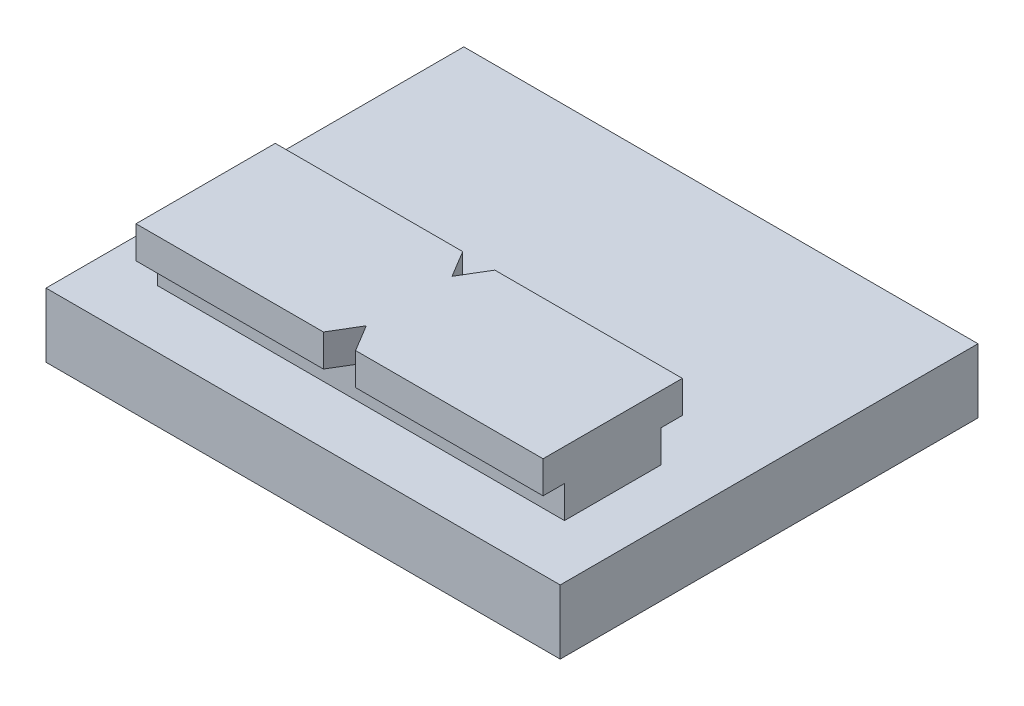
ISO-10303-21;
HEADER;
FILE_DESCRIPTION(('STEP AP214'),'2;1');
FILE_NAME('part.step','',(''),(''),'','','');
FILE_SCHEMA(('AUTOMOTIVE_DESIGN { 1 0 10303 214 1 1 1 1 }'));
ENDSEC;
DATA;
#1=APPLICATION_CONTEXT('core data for automotive mechanical design processes');
#2=APPLICATION_PROTOCOL_DEFINITION('international standard','automotive_design',2000,#1);
#3=PRODUCT_CONTEXT('',#1,'mechanical');
#4=PRODUCT('Part','Part','',(#3));
#5=PRODUCT_RELATED_PRODUCT_CATEGORY('part','',(#4));
#6=PRODUCT_DEFINITION_FORMATION('','',#4);
#7=PRODUCT_DEFINITION_CONTEXT('part definition',#1,'design');
#8=PRODUCT_DEFINITION('design','',#6,#7);
#9=PRODUCT_DEFINITION_SHAPE('','',#8);
#10=(LENGTH_UNIT() NAMED_UNIT(*) SI_UNIT(.MILLI.,.METRE.));
#11=(NAMED_UNIT(*) PLANE_ANGLE_UNIT() SI_UNIT($,.RADIAN.));
#12=(NAMED_UNIT(*) SI_UNIT($,.STERADIAN.) SOLID_ANGLE_UNIT());
#13=UNCERTAINTY_MEASURE_WITH_UNIT(LENGTH_MEASURE(1.E-05),#10,'distance_accuracy_value','');
#14=(GEOMETRIC_REPRESENTATION_CONTEXT(3) GLOBAL_UNCERTAINTY_ASSIGNED_CONTEXT((#13)) GLOBAL_UNIT_ASSIGNED_CONTEXT((#10,
#11,#12)) REPRESENTATION_CONTEXT('',''));
#15=CARTESIAN_POINT('',(0.,0.,0.));
#16=DIRECTION('',(0.,0.,1.));
#17=DIRECTION('',(1.,0.,0.));
#18=AXIS2_PLACEMENT_3D('',#15,#16,#17);
#19=CARTESIAN_POINT('',(-9.5,6.,8.05));
#20=DIRECTION('',(0.,0.,-1.));
#21=DIRECTION('',(-1.,0.,0.));
#22=AXIS2_PLACEMENT_3D('',#19,#20,#21);
#23=PLANE('',#22);
#24=DIRECTION('',(1.,0.,0.));
#25=VECTOR('',#24,1.);
#26=CARTESIAN_POINT('',(-9.5,6.,8.05));
#27=LINE('',#26,#25);
#28=CARTESIAN_POINT('',(0.750000000000001,6.,8.05));
#29=VERTEX_POINT('',#28);
#30=CARTESIAN_POINT('',(9.5,6.,8.05));
#31=VERTEX_POINT('',#30);
#32=EDGE_CURVE('E190',#29,#31,#27,.T.);
#33=ORIENTED_EDGE('',*,*,#32,.F.);
#34=DIRECTION('',(0.,1.,0.));
#35=VECTOR('',#34,1.);
#36=CARTESIAN_POINT('',(0.750000000000001,2.54743758102334,8.05));
#37=LINE('',#36,#35);
#38=CARTESIAN_POINT('',(0.750000000000001,4.5,8.05));
#39=VERTEX_POINT('',#38);
#40=EDGE_CURVE('E176',#39,#29,#37,.T.);
#41=ORIENTED_EDGE('',*,*,#40,.F.);
#42=DIRECTION('',(1.,0.,0.));
#43=VECTOR('',#42,1.);
#44=CARTESIAN_POINT('',(-9.5,4.5,8.05));
#45=LINE('',#44,#43);
#46=CARTESIAN_POINT('',(9.5,4.5,8.05));
#47=VERTEX_POINT('',#46);
#48=EDGE_CURVE('E188',#39,#47,#45,.T.);
#49=ORIENTED_EDGE('',*,*,#48,.T.);
#50=DIRECTION('',(0.,-1.,0.));
#51=VECTOR('',#50,1.);
#52=CARTESIAN_POINT('',(9.5,6.,8.05));
#53=LINE('',#52,#51);
#54=EDGE_CURVE('E209',#31,#47,#53,.T.);
#55=ORIENTED_EDGE('',*,*,#54,.F.);
#56=EDGE_LOOP('',(#33,#41,#49,#55));
#57=FACE_BOUND('',#56,.T.);
#58=ADVANCED_FACE('F35',(#57),#23,.F.);
#59=CARTESIAN_POINT('',(0.,4.5,0.));
#60=DIRECTION('',(0.,-1.,0.));
#61=DIRECTION('',(0.,0.,-1.));
#62=AXIS2_PLACEMENT_3D('',#59,#60,#61);
#63=PLANE('',#62);
#64=DIRECTION('',(-0.514495755427527,0.,-0.857492925712544));
#65=VECTOR('',#64,1.);
#66=CARTESIAN_POINT('',(0.,4.5,6.8));
#67=LINE('',#66,#65);
#68=CARTESIAN_POINT('',(0.150000000000001,4.5,7.05));
#69=VERTEX_POINT('',#68);
#70=EDGE_CURVE('E172',#39,#69,#67,.T.);
#71=ORIENTED_EDGE('',*,*,#70,.T.);
#72=DIRECTION('',(1.,0.,0.));
#73=VECTOR('',#72,1.);
#74=CARTESIAN_POINT('',(-9.5,4.5,7.05));
#75=LINE('',#74,#73);
#76=CARTESIAN_POINT('',(9.5,4.5,7.05));
#77=VERTEX_POINT('',#76);
#78=EDGE_CURVE('E294',#69,#77,#75,.T.);
#79=ORIENTED_EDGE('',*,*,#78,.T.);
#80=DIRECTION('',(0.,0.,-1.));
#81=VECTOR('',#80,1.);
#82=CARTESIAN_POINT('',(9.5,4.5,8.05));
#83=LINE('',#82,#81);
#84=EDGE_CURVE('E196',#47,#77,#83,.T.);
#85=ORIENTED_EDGE('',*,*,#84,.F.);
#86=ORIENTED_EDGE('',*,*,#48,.F.);
#87=EDGE_LOOP('',(#71,#79,#85,#86));
#88=FACE_BOUND('',#87,.T.);
#89=ADVANCED_FACE('F194',(#88),#63,.T.);
#90=DIRECTION('',(0.514495755427527,0.,-0.857492925712544));
#91=VECTOR('',#90,1.);
#92=CARTESIAN_POINT('',(0.,4.5,2.8));
#93=LINE('',#92,#91);
#94=CARTESIAN_POINT('',(0.149999999999998,4.5,2.55));
#95=VERTEX_POINT('',#94);
#96=CARTESIAN_POINT('',(0.75,4.5,1.55));
#97=VERTEX_POINT('',#96);
#98=EDGE_CURVE('E301',#95,#97,#93,.T.);
#99=ORIENTED_EDGE('',*,*,#98,.T.);
#100=DIRECTION('',(-1.,0.,0.));
#101=VECTOR('',#100,1.);
#102=CARTESIAN_POINT('',(-9.5,4.5,1.55));
#103=LINE('',#102,#101);
#104=CARTESIAN_POINT('',(9.5,4.5,1.55));
#105=VERTEX_POINT('',#104);
#106=EDGE_CURVE('E229',#105,#97,#103,.T.);
#107=ORIENTED_EDGE('',*,*,#106,.F.);
#108=CARTESIAN_POINT('',(9.5,4.5,2.55));
#109=VERTEX_POINT('',#108);
#110=EDGE_CURVE('E225',#109,#105,#83,.T.);
#111=ORIENTED_EDGE('',*,*,#110,.F.);
#112=DIRECTION('',(-1.,0.,0.));
#113=VECTOR('',#112,1.);
#114=CARTESIAN_POINT('',(-9.5,4.5,2.55));
#115=LINE('',#114,#113);
#116=EDGE_CURVE('E258',#109,#95,#115,.T.);
#117=ORIENTED_EDGE('',*,*,#116,.T.);
#118=EDGE_LOOP('',(#99,#107,#111,#117));
#119=FACE_BOUND('',#118,.T.);
#120=ADVANCED_FACE('F300',(#119),#63,.T.);
#121=CARTESIAN_POINT('',(-9.5,6.,1.55));
#122=DIRECTION('',(0.,0.,1.));
#123=DIRECTION('',(1.,0.,0.));
#124=AXIS2_PLACEMENT_3D('',#121,#122,#123);
#125=PLANE('',#124);
#126=ORIENTED_EDGE('',*,*,#106,.T.);
#127=DIRECTION('',(0.,1.,0.));
#128=VECTOR('',#127,1.);
#129=CARTESIAN_POINT('',(0.75,2.54743758102334,1.55));
#130=LINE('',#129,#128);
#131=CARTESIAN_POINT('',(0.75,6.,1.55));
#132=VERTEX_POINT('',#131);
#133=EDGE_CURVE('E372',#97,#132,#130,.T.);
#134=ORIENTED_EDGE('',*,*,#133,.T.);
#135=DIRECTION('',(-1.,0.,0.));
#136=VECTOR('',#135,1.);
#137=CARTESIAN_POINT('',(-9.5,6.,1.55));
#138=LINE('',#137,#136);
#139=CARTESIAN_POINT('',(9.5,6.,1.55));
#140=VERTEX_POINT('',#139);
#141=EDGE_CURVE('E383',#140,#132,#138,.T.);
#142=ORIENTED_EDGE('',*,*,#141,.F.);
#143=DIRECTION('',(0.,-1.,0.));
#144=VECTOR('',#143,1.);
#145=CARTESIAN_POINT('',(9.5,6.,1.55));
#146=LINE('',#145,#144);
#147=EDGE_CURVE('E218',#140,#105,#146,.T.);
#148=ORIENTED_EDGE('',*,*,#147,.T.);
#149=EDGE_LOOP('',(#126,#134,#142,#148));
#150=FACE_BOUND('',#149,.T.);
#151=ADVANCED_FACE('F395',(#150),#125,.F.);
#152=CARTESIAN_POINT('',(0.,3.,0.));
#153=DIRECTION('',(0.,-1.,0.));
#154=DIRECTION('',(0.,0.,-1.));
#155=AXIS2_PLACEMENT_3D('',#152,#153,#154);
#156=PLANE('',#155);
#157=DIRECTION('',(0.,0.,-1.));
#158=VECTOR('',#157,1.);
#159=CARTESIAN_POINT('',(12.,3.,9.75));
#160=LINE('',#159,#158);
#161=CARTESIAN_POINT('',(12.,3.,9.75));
#162=VERTEX_POINT('',#161);
#163=CARTESIAN_POINT('',(12.,3.,-9.75));
#164=VERTEX_POINT('',#163);
#165=EDGE_CURVE('E315',#162,#164,#160,.T.);
#166=ORIENTED_EDGE('',*,*,#165,.T.);
#167=DIRECTION('',(-1.,0.,0.));
#168=VECTOR('',#167,1.);
#169=CARTESIAN_POINT('',(-12.,3.,-9.75));
#170=LINE('',#169,#168);
#171=CARTESIAN_POINT('',(-12.,3.,-9.75));
#172=VERTEX_POINT('',#171);
#173=EDGE_CURVE('E318',#164,#172,#170,.T.);
#174=ORIENTED_EDGE('',*,*,#173,.T.);
#175=DIRECTION('',(0.,0.,1.));
#176=VECTOR('',#175,1.);
#177=CARTESIAN_POINT('',(-12.,3.,9.75));
#178=LINE('',#177,#176);
#179=CARTESIAN_POINT('',(-12.,3.,9.75));
#180=VERTEX_POINT('',#179);
#181=EDGE_CURVE('E321',#172,#180,#178,.T.);
#182=ORIENTED_EDGE('',*,*,#181,.T.);
#183=DIRECTION('',(1.,0.,0.));
#184=VECTOR('',#183,1.);
#185=CARTESIAN_POINT('',(-12.,3.,9.75));
#186=LINE('',#185,#184);
#187=EDGE_CURVE('E323',#180,#162,#186,.T.);
#188=ORIENTED_EDGE('',*,*,#187,.T.);
#189=EDGE_LOOP('',(#166,#174,#182,#188));
#190=FACE_BOUND('',#189,.T.);
#191=DIRECTION('',(0.,0.,-1.));
#192=VECTOR('',#191,1.);
#193=CARTESIAN_POINT('',(9.5,3.,7.05));
#194=LINE('',#193,#192);
#195=CARTESIAN_POINT('',(9.5,3.,7.05));
#196=VERTEX_POINT('',#195);
#197=CARTESIAN_POINT('',(9.5,3.,2.55));
#198=VERTEX_POINT('',#197);
#199=EDGE_CURVE('E221',#196,#198,#194,.T.);
#200=ORIENTED_EDGE('',*,*,#199,.F.);
#201=DIRECTION('',(1.,0.,0.));
#202=VECTOR('',#201,1.);
#203=CARTESIAN_POINT('',(-9.5,3.,7.05));
#204=LINE('',#203,#202);
#205=CARTESIAN_POINT('',(-9.5,3.,7.05));
#206=VERTEX_POINT('',#205);
#207=EDGE_CURVE('E259',#206,#196,#204,.T.);
#208=ORIENTED_EDGE('',*,*,#207,.F.);
#209=DIRECTION('',(0.,0.,1.));
#210=VECTOR('',#209,1.);
#211=CARTESIAN_POINT('',(-9.5,3.,7.05));
#212=LINE('',#211,#210);
#213=CARTESIAN_POINT('',(-9.5,3.,2.55));
#214=VERTEX_POINT('',#213);
#215=EDGE_CURVE('E311',#214,#206,#212,.T.);
#216=ORIENTED_EDGE('',*,*,#215,.F.);
#217=DIRECTION('',(-1.,0.,0.));
#218=VECTOR('',#217,1.);
#219=CARTESIAN_POINT('',(-9.5,3.,2.55));
#220=LINE('',#219,#218);
#221=EDGE_CURVE('E265',#198,#214,#220,.T.);
#222=ORIENTED_EDGE('',*,*,#221,.F.);
#223=EDGE_LOOP('',(#200,#208,#216,#222));
#224=FACE_BOUND('',#223,.T.);
#225=ADVANCED_FACE('F392',(#190,#224),#156,.F.);
#226=CARTESIAN_POINT('',(12.,3.,9.75));
#227=DIRECTION('',(-1.,0.,0.));
#228=DIRECTION('',(0.,0.,1.));
#229=AXIS2_PLACEMENT_3D('',#226,#227,#228);
#230=PLANE('',#229);
#231=DIRECTION('',(0.,0.,-1.));
#232=VECTOR('',#231,1.);
#233=CARTESIAN_POINT('',(12.,0.,9.75));
#234=LINE('',#233,#232);
#235=CARTESIAN_POINT('',(12.,0.,9.75));
#236=VERTEX_POINT('',#235);
#237=CARTESIAN_POINT('',(12.,0.,-9.75));
#238=VERTEX_POINT('',#237);
#239=EDGE_CURVE('E269',#236,#238,#234,.T.);
#240=ORIENTED_EDGE('',*,*,#239,.T.);
#241=DIRECTION('',(0.,-1.,0.));
#242=VECTOR('',#241,1.);
#243=CARTESIAN_POINT('',(12.,3.,-9.75));
#244=LINE('',#243,#242);
#245=EDGE_CURVE('E43',#164,#238,#244,.T.);
#246=ORIENTED_EDGE('',*,*,#245,.F.);
#247=ORIENTED_EDGE('',*,*,#165,.F.);
#248=DIRECTION('',(0.,-1.,0.));
#249=VECTOR('',#248,1.);
#250=CARTESIAN_POINT('',(12.,3.,9.75));
#251=LINE('',#250,#249);
#252=EDGE_CURVE('E325',#162,#236,#251,.T.);
#253=ORIENTED_EDGE('',*,*,#252,.T.);
#254=EDGE_LOOP('',(#240,#246,#247,#253));
#255=FACE_BOUND('',#254,.T.);
#256=ADVANCED_FACE('F37',(#255),#230,.F.);
#257=CARTESIAN_POINT('',(-12.,3.,-9.75));
#258=DIRECTION('',(0.,0.,1.));
#259=DIRECTION('',(1.,0.,0.));
#260=AXIS2_PLACEMENT_3D('',#257,#258,#259);
#261=PLANE('',#260);
#262=DIRECTION('',(-1.,0.,0.));
#263=VECTOR('',#262,1.);
#264=CARTESIAN_POINT('',(-12.,0.,-9.75));
#265=LINE('',#264,#263);
#266=CARTESIAN_POINT('',(-12.,0.,-9.75));
#267=VERTEX_POINT('',#266);
#268=EDGE_CURVE('E328',#238,#267,#265,.T.);
#269=ORIENTED_EDGE('',*,*,#268,.T.);
#270=DIRECTION('',(0.,-1.,0.));
#271=VECTOR('',#270,1.);
#272=CARTESIAN_POINT('',(-12.,3.,-9.75));
#273=LINE('',#272,#271);
#274=EDGE_CURVE('E338',#172,#267,#273,.T.);
#275=ORIENTED_EDGE('',*,*,#274,.F.);
#276=ORIENTED_EDGE('',*,*,#173,.F.);
#277=ORIENTED_EDGE('',*,*,#245,.T.);
#278=EDGE_LOOP('',(#269,#275,#276,#277));
#279=FACE_BOUND('',#278,.T.);
#280=ADVANCED_FACE('F581',(#279),#261,.F.);
#281=CARTESIAN_POINT('',(-12.,3.,9.75));
#282=DIRECTION('',(1.,0.,0.));
#283=DIRECTION('',(0.,0.,-1.));
#284=AXIS2_PLACEMENT_3D('',#281,#282,#283);
#285=PLANE('',#284);
#286=DIRECTION('',(0.,0.,1.));
#287=VECTOR('',#286,1.);
#288=CARTESIAN_POINT('',(-12.,0.,9.75));
#289=LINE('',#288,#287);
#290=CARTESIAN_POINT('',(-12.,0.,9.75));
#291=VERTEX_POINT('',#290);
#292=EDGE_CURVE('E330',#267,#291,#289,.T.);
#293=ORIENTED_EDGE('',*,*,#292,.T.);
#294=DIRECTION('',(0.,-1.,0.));
#295=VECTOR('',#294,1.);
#296=CARTESIAN_POINT('',(-12.,3.,9.75));
#297=LINE('',#296,#295);
#298=EDGE_CURVE('E335',#180,#291,#297,.T.);
#299=ORIENTED_EDGE('',*,*,#298,.F.);
#300=ORIENTED_EDGE('',*,*,#181,.F.);
#301=ORIENTED_EDGE('',*,*,#274,.T.);
#302=EDGE_LOOP('',(#293,#299,#300,#301));
#303=FACE_BOUND('',#302,.T.);
#304=ADVANCED_FACE('F573',(#303),#285,.F.);
#305=CARTESIAN_POINT('',(-12.,3.,9.75));
#306=DIRECTION('',(0.,0.,-1.));
#307=DIRECTION('',(-1.,0.,0.));
#308=AXIS2_PLACEMENT_3D('',#305,#306,#307);
#309=PLANE('',#308);
#310=DIRECTION('',(1.,0.,0.));
#311=VECTOR('',#310,1.);
#312=CARTESIAN_POINT('',(-12.,0.,9.75));
#313=LINE('',#312,#311);
#314=EDGE_CURVE('E319',#291,#236,#313,.T.);
#315=ORIENTED_EDGE('',*,*,#314,.T.);
#316=ORIENTED_EDGE('',*,*,#252,.F.);
#317=ORIENTED_EDGE('',*,*,#187,.F.);
#318=ORIENTED_EDGE('',*,*,#298,.T.);
#319=EDGE_LOOP('',(#315,#316,#317,#318));
#320=FACE_BOUND('',#319,.T.);
#321=ADVANCED_FACE('F565',(#320),#309,.F.);
#322=CARTESIAN_POINT('',(0.,0.,0.));
#323=DIRECTION('',(0.,-1.,0.));
#324=DIRECTION('',(0.,0.,-1.));
#325=AXIS2_PLACEMENT_3D('',#322,#323,#324);
#326=PLANE('',#325);
#327=ORIENTED_EDGE('',*,*,#239,.F.);
#328=ORIENTED_EDGE('',*,*,#314,.F.);
#329=ORIENTED_EDGE('',*,*,#292,.F.);
#330=ORIENTED_EDGE('',*,*,#268,.F.);
#331=EDGE_LOOP('',(#327,#328,#329,#330));
#332=FACE_BOUND('',#331,.T.);
#333=ADVANCED_FACE('F541',(#332),#326,.T.);
#334=CARTESIAN_POINT('',(9.5,4.5,7.05));
#335=DIRECTION('',(-1.,0.,0.));
#336=DIRECTION('',(0.,0.,1.));
#337=AXIS2_PLACEMENT_3D('',#334,#335,#336);
#338=PLANE('',#337);
#339=ORIENTED_EDGE('',*,*,#199,.T.);
#340=DIRECTION('',(0.,-1.,0.));
#341=VECTOR('',#340,1.);
#342=CARTESIAN_POINT('',(9.5,4.5,2.55));
#343=LINE('',#342,#341);
#344=EDGE_CURVE('E266',#109,#198,#343,.T.);
#345=ORIENTED_EDGE('',*,*,#344,.F.);
#346=ORIENTED_EDGE('',*,*,#110,.T.);
#347=ORIENTED_EDGE('',*,*,#147,.F.);
#348=DIRECTION('',(0.,0.,-1.));
#349=VECTOR('',#348,1.);
#350=CARTESIAN_POINT('',(9.5,6.,8.05));
#351=LINE('',#350,#349);
#352=EDGE_CURVE('E201',#31,#140,#351,.T.);
#353=ORIENTED_EDGE('',*,*,#352,.F.);
#354=ORIENTED_EDGE('',*,*,#54,.T.);
#355=ORIENTED_EDGE('',*,*,#84,.T.);
#356=DIRECTION('',(0.,-1.,0.));
#357=VECTOR('',#356,1.);
#358=CARTESIAN_POINT('',(9.5,4.5,7.05));
#359=LINE('',#358,#357);
#360=EDGE_CURVE('E272',#77,#196,#359,.T.);
#361=ORIENTED_EDGE('',*,*,#360,.T.);
#362=EDGE_LOOP('',(#339,#345,#346,#347,#353,#354,#355,#361));
#363=FACE_BOUND('',#362,.T.);
#364=ADVANCED_FACE('F306',(#363),#338,.F.);
#365=CARTESIAN_POINT('',(-9.5,4.5,2.55));
#366=DIRECTION('',(0.,0.,1.));
#367=DIRECTION('',(1.,0.,0.));
#368=AXIS2_PLACEMENT_3D('',#365,#366,#367);
#369=PLANE('',#368);
#370=ORIENTED_EDGE('',*,*,#221,.T.);
#371=DIRECTION('',(0.,-1.,0.));
#372=VECTOR('',#371,1.);
#373=CARTESIAN_POINT('',(-9.5,4.5,2.55));
#374=LINE('',#373,#372);
#375=CARTESIAN_POINT('',(-9.5,4.5,2.55));
#376=VERTEX_POINT('',#375);
#377=EDGE_CURVE('E262',#376,#214,#374,.T.);
#378=ORIENTED_EDGE('',*,*,#377,.F.);
#379=CARTESIAN_POINT('',(-0.15,4.5,2.55));
#380=VERTEX_POINT('',#379);
#381=EDGE_CURVE('E253',#380,#376,#115,.T.);
#382=ORIENTED_EDGE('',*,*,#381,.F.);
#383=DIRECTION('',(1.,0.,0.));
#384=VECTOR('',#383,1.);
#385=CARTESIAN_POINT('',(-9.5,4.5,2.55));
#386=LINE('',#385,#384);
#387=EDGE_CURVE('E304',#380,#95,#386,.T.);
#388=ORIENTED_EDGE('',*,*,#387,.T.);
#389=ORIENTED_EDGE('',*,*,#116,.F.);
#390=ORIENTED_EDGE('',*,*,#344,.T.);
#391=EDGE_LOOP('',(#370,#378,#382,#388,#389,#390));
#392=FACE_BOUND('',#391,.T.);
#393=ADVANCED_FACE('F263',(#392),#369,.F.);
#394=CARTESIAN_POINT('',(-9.5,4.5,7.05));
#395=DIRECTION('',(1.,0.,0.));
#396=DIRECTION('',(0.,0.,-1.));
#397=AXIS2_PLACEMENT_3D('',#394,#395,#396);
#398=PLANE('',#397);
#399=ORIENTED_EDGE('',*,*,#215,.T.);
#400=DIRECTION('',(0.,-1.,0.));
#401=VECTOR('',#400,1.);
#402=CARTESIAN_POINT('',(-9.5,4.5,7.05));
#403=LINE('',#402,#401);
#404=CARTESIAN_POINT('',(-9.5,4.5,7.05));
#405=VERTEX_POINT('',#404);
#406=EDGE_CURVE('E267',#405,#206,#403,.T.);
#407=ORIENTED_EDGE('',*,*,#406,.F.);
#408=DIRECTION('',(0.,0.,1.));
#409=VECTOR('',#408,1.);
#410=CARTESIAN_POINT('',(-9.5,4.5,8.05));
#411=LINE('',#410,#409);
#412=CARTESIAN_POINT('',(-9.5,4.5,8.05));
#413=VERTEX_POINT('',#412);
#414=EDGE_CURVE('E203',#405,#413,#411,.T.);
#415=ORIENTED_EDGE('',*,*,#414,.T.);
#416=DIRECTION('',(0.,-1.,0.));
#417=VECTOR('',#416,1.);
#418=CARTESIAN_POINT('',(-9.5,6.,8.05));
#419=LINE('',#418,#417);
#420=CARTESIAN_POINT('',(-9.5,6.,8.05));
#421=VERTEX_POINT('',#420);
#422=EDGE_CURVE('E211',#421,#413,#419,.T.);
#423=ORIENTED_EDGE('',*,*,#422,.F.);
#424=DIRECTION('',(0.,0.,1.));
#425=VECTOR('',#424,1.);
#426=CARTESIAN_POINT('',(-9.5,6.,8.05));
#427=LINE('',#426,#425);
#428=CARTESIAN_POINT('',(-9.5,6.,1.55));
#429=VERTEX_POINT('',#428);
#430=EDGE_CURVE('E250',#429,#421,#427,.T.);
#431=ORIENTED_EDGE('',*,*,#430,.F.);
#432=DIRECTION('',(0.,-1.,0.));
#433=VECTOR('',#432,1.);
#434=CARTESIAN_POINT('',(-9.5,6.,1.55));
#435=LINE('',#434,#433);
#436=CARTESIAN_POINT('',(-9.5,4.5,1.55));
#437=VERTEX_POINT('',#436);
#438=EDGE_CURVE('E215',#429,#437,#435,.T.);
#439=ORIENTED_EDGE('',*,*,#438,.T.);
#440=EDGE_CURVE('E198',#437,#376,#411,.T.);
#441=ORIENTED_EDGE('',*,*,#440,.T.);
#442=ORIENTED_EDGE('',*,*,#377,.T.);
#443=EDGE_LOOP('',(#399,#407,#415,#423,#431,#439,#441,#442));
#444=FACE_BOUND('',#443,.T.);
#445=ADVANCED_FACE('F247',(#444),#398,.F.);
#446=CARTESIAN_POINT('',(-9.5,4.5,7.05));
#447=DIRECTION('',(0.,0.,-1.));
#448=DIRECTION('',(-1.,0.,0.));
#449=AXIS2_PLACEMENT_3D('',#446,#447,#448);
#450=PLANE('',#449);
#451=ORIENTED_EDGE('',*,*,#207,.T.);
#452=ORIENTED_EDGE('',*,*,#360,.F.);
#453=ORIENTED_EDGE('',*,*,#78,.F.);
#454=CARTESIAN_POINT('',(-0.150000000000001,4.5,7.05));
#455=VERTEX_POINT('',#454);
#456=EDGE_CURVE('E282',#455,#69,#75,.T.);
#457=ORIENTED_EDGE('',*,*,#456,.F.);
#458=EDGE_CURVE('E292',#405,#455,#75,.T.);
#459=ORIENTED_EDGE('',*,*,#458,.F.);
#460=ORIENTED_EDGE('',*,*,#406,.T.);
#461=EDGE_LOOP('',(#451,#452,#453,#457,#459,#460));
#462=FACE_BOUND('',#461,.T.);
#463=ADVANCED_FACE('F352',(#462),#450,.F.);
#464=DIRECTION('',(0.514495755427526,0.,0.857492925712544));
#465=VECTOR('',#464,1.);
#466=CARTESIAN_POINT('',(-0.75,4.5,1.55));
#467=LINE('',#466,#465);
#468=CARTESIAN_POINT('',(-0.75,4.5,1.55));
#469=VERTEX_POINT('',#468);
#470=EDGE_CURVE('E255',#469,#380,#467,.T.);
#471=ORIENTED_EDGE('',*,*,#470,.T.);
#472=ORIENTED_EDGE('',*,*,#381,.T.);
#473=ORIENTED_EDGE('',*,*,#440,.F.);
#474=EDGE_CURVE('E224',#469,#437,#103,.T.);
#475=ORIENTED_EDGE('',*,*,#474,.F.);
#476=EDGE_LOOP('',(#471,#472,#473,#475));
#477=FACE_BOUND('',#476,.T.);
#478=ADVANCED_FACE('F251',(#477),#63,.T.);
#479=CARTESIAN_POINT('',(-0.75,6.,1.55));
#480=VERTEX_POINT('',#479);
#481=EDGE_CURVE('E382',#480,#429,#138,.T.);
#482=ORIENTED_EDGE('',*,*,#481,.F.);
#483=DIRECTION('',(0.,1.,0.));
#484=VECTOR('',#483,1.);
#485=CARTESIAN_POINT('',(-0.75,2.54743758102334,1.55));
#486=LINE('',#485,#484);
#487=EDGE_CURVE('E57',#469,#480,#486,.T.);
#488=ORIENTED_EDGE('',*,*,#487,.F.);
#489=ORIENTED_EDGE('',*,*,#474,.T.);
#490=ORIENTED_EDGE('',*,*,#438,.F.);
#491=EDGE_LOOP('',(#482,#488,#489,#490));
#492=FACE_BOUND('',#491,.T.);
#493=ADVANCED_FACE('F240',(#492),#125,.F.);
#494=CARTESIAN_POINT('',(-0.749999999999999,4.5,8.05));
#495=VERTEX_POINT('',#494);
#496=EDGE_CURVE('E197',#413,#495,#45,.T.);
#497=ORIENTED_EDGE('',*,*,#496,.T.);
#498=DIRECTION('',(0.,1.,0.));
#499=VECTOR('',#498,1.);
#500=CARTESIAN_POINT('',(-0.749999999999999,2.54743758102334,8.05));
#501=LINE('',#500,#499);
#502=CARTESIAN_POINT('',(-0.749999999999999,6.,8.05));
#503=VERTEX_POINT('',#502);
#504=EDGE_CURVE('E49',#495,#503,#501,.T.);
#505=ORIENTED_EDGE('',*,*,#504,.T.);
#506=EDGE_CURVE('E212',#421,#503,#27,.T.);
#507=ORIENTED_EDGE('',*,*,#506,.F.);
#508=ORIENTED_EDGE('',*,*,#422,.T.);
#509=EDGE_LOOP('',(#497,#505,#507,#508));
#510=FACE_BOUND('',#509,.T.);
#511=ADVANCED_FACE('F391',(#510),#23,.F.);
#512=CARTESIAN_POINT('',(0.,6.,0.));
#513=DIRECTION('',(0.,-1.,0.));
#514=DIRECTION('',(0.,0.,-1.));
#515=AXIS2_PLACEMENT_3D('',#512,#513,#514);
#516=PLANE('',#515);
#517=DIRECTION('',(-0.514495755427526,0.,0.857492925712544));
#518=VECTOR('',#517,1.);
#519=CARTESIAN_POINT('',(-0.749999999999999,6.,8.05));
#520=LINE('',#519,#518);
#521=CARTESIAN_POINT('',(0.,6.,6.8));
#522=VERTEX_POINT('',#521);
#523=EDGE_CURVE('E363',#522,#503,#520,.T.);
#524=ORIENTED_EDGE('',*,*,#523,.F.);
#525=DIRECTION('',(-0.514495755427527,0.,-0.857492925712544));
#526=VECTOR('',#525,1.);
#527=CARTESIAN_POINT('',(0.,6.,6.8));
#528=LINE('',#527,#526);
#529=EDGE_CURVE('E191',#29,#522,#528,.T.);
#530=ORIENTED_EDGE('',*,*,#529,.F.);
#531=ORIENTED_EDGE('',*,*,#32,.T.);
#532=ORIENTED_EDGE('',*,*,#352,.T.);
#533=ORIENTED_EDGE('',*,*,#141,.T.);
#534=DIRECTION('',(0.514495755427527,0.,-0.857492925712544));
#535=VECTOR('',#534,1.);
#536=CARTESIAN_POINT('',(0.,6.,2.8));
#537=LINE('',#536,#535);
#538=CARTESIAN_POINT('',(0.,6.,2.8));
#539=VERTEX_POINT('',#538);
#540=EDGE_CURVE('E366',#539,#132,#537,.T.);
#541=ORIENTED_EDGE('',*,*,#540,.F.);
#542=DIRECTION('',(0.514495755427526,0.,0.857492925712544));
#543=VECTOR('',#542,1.);
#544=CARTESIAN_POINT('',(-0.75,6.,1.55));
#545=LINE('',#544,#543);
#546=EDGE_CURVE('E359',#480,#539,#545,.T.);
#547=ORIENTED_EDGE('',*,*,#546,.F.);
#548=ORIENTED_EDGE('',*,*,#481,.T.);
#549=ORIENTED_EDGE('',*,*,#430,.T.);
#550=ORIENTED_EDGE('',*,*,#506,.T.);
#551=EDGE_LOOP('',(#524,#530,#531,#532,#533,#541,#547,#548,#549,#550));
#552=FACE_BOUND('',#551,.T.);
#553=ADVANCED_FACE('F389',(#552),#516,.F.);
#554=DIRECTION('',(0.514495755427526,0.,-0.857492925712545));
#555=VECTOR('',#554,1.);
#556=CARTESIAN_POINT('',(3.,4.5,1.8));
#557=LINE('',#556,#555);
#558=EDGE_CURVE('E11',#495,#455,#557,.T.);
#559=ORIENTED_EDGE('',*,*,#558,.F.);
#560=ORIENTED_EDGE('',*,*,#496,.F.);
#561=ORIENTED_EDGE('',*,*,#414,.F.);
#562=ORIENTED_EDGE('',*,*,#458,.T.);
#563=EDGE_LOOP('',(#559,#560,#561,#562));
#564=FACE_BOUND('',#563,.T.);
#565=ADVANCED_FACE('F348',(#564),#63,.T.);
#566=CARTESIAN_POINT('',(0.,4.5,0.));
#567=DIRECTION('',(0.,-1.,0.));
#568=DIRECTION('',(0.,0.,-1.));
#569=AXIS2_PLACEMENT_3D('',#566,#567,#568);
#570=PLANE('',#569);
#571=CARTESIAN_POINT('',(0.,4.5,2.8));
#572=VERTEX_POINT('',#571);
#573=EDGE_CURVE('E375',#380,#572,#467,.T.);
#574=ORIENTED_EDGE('',*,*,#573,.T.);
#575=EDGE_CURVE('E369',#572,#95,#93,.T.);
#576=ORIENTED_EDGE('',*,*,#575,.T.);
#577=ORIENTED_EDGE('',*,*,#387,.F.);
#578=EDGE_LOOP('',(#574,#576,#577));
#579=FACE_BOUND('',#578,.T.);
#580=ADVANCED_FACE('F409',(#579),#570,.F.);
#581=CARTESIAN_POINT('',(0.,2.54743758102334,2.8));
#582=DIRECTION('',(0.857492925712544,0.,0.514495755427527));
#583=DIRECTION('',(0.514495755427527,0.,-0.857492925712544));
#584=AXIS2_PLACEMENT_3D('',#581,#582,#583);
#585=PLANE('',#584);
#586=DIRECTION('',(0.,1.,0.));
#587=VECTOR('',#586,1.);
#588=CARTESIAN_POINT('',(0.,2.54743758102334,2.8));
#589=LINE('',#588,#587);
#590=EDGE_CURVE('E374',#572,#539,#589,.T.);
#591=ORIENTED_EDGE('',*,*,#590,.T.);
#592=ORIENTED_EDGE('',*,*,#540,.T.);
#593=ORIENTED_EDGE('',*,*,#133,.F.);
#594=ORIENTED_EDGE('',*,*,#98,.F.);
#595=ORIENTED_EDGE('',*,*,#575,.F.);
#596=EDGE_LOOP('',(#591,#592,#593,#594,#595));
#597=FACE_BOUND('',#596,.T.);
#598=ADVANCED_FACE('F397',(#597),#585,.F.);
#599=CARTESIAN_POINT('',(-0.75,2.54743758102334,1.55));
#600=DIRECTION('',(-0.857492925712544,0.,0.514495755427526));
#601=DIRECTION('',(0.514495755427526,0.,0.857492925712544));
#602=AXIS2_PLACEMENT_3D('',#599,#600,#601);
#603=PLANE('',#602);
#604=ORIENTED_EDGE('',*,*,#487,.T.);
#605=ORIENTED_EDGE('',*,*,#546,.T.);
#606=ORIENTED_EDGE('',*,*,#590,.F.);
#607=ORIENTED_EDGE('',*,*,#573,.F.);
#608=ORIENTED_EDGE('',*,*,#470,.F.);
#609=EDGE_LOOP('',(#604,#605,#606,#607,#608));
#610=FACE_BOUND('',#609,.T.);
#611=ADVANCED_FACE('F401',(#610),#603,.F.);
#612=CARTESIAN_POINT('',(0.,4.5,0.));
#613=DIRECTION('',(0.,-1.,0.));
#614=DIRECTION('',(0.,0.,-1.));
#615=AXIS2_PLACEMENT_3D('',#612,#613,#614);
#616=PLANE('',#615);
#617=CARTESIAN_POINT('',(0.,4.5,6.8));
#618=VERTEX_POINT('',#617);
#619=EDGE_CURVE('E179',#69,#618,#67,.T.);
#620=ORIENTED_EDGE('',*,*,#619,.T.);
#621=DIRECTION('',(-0.514495755427526,0.,0.857492925712545));
#622=VECTOR('',#621,1.);
#623=CARTESIAN_POINT('',(-0.749999999999999,4.5,8.05));
#624=LINE('',#623,#622);
#625=EDGE_CURVE('E357',#618,#455,#624,.T.);
#626=ORIENTED_EDGE('',*,*,#625,.T.);
#627=ORIENTED_EDGE('',*,*,#456,.T.);
#628=EDGE_LOOP('',(#620,#626,#627));
#629=FACE_BOUND('',#628,.T.);
#630=ADVANCED_FACE('F355',(#629),#616,.F.);
#631=CARTESIAN_POINT('',(0.,2.54743758102334,6.8));
#632=DIRECTION('',(0.857492925712544,0.,-0.514495755427527));
#633=DIRECTION('',(-0.514495755427527,0.,-0.857492925712544));
#634=AXIS2_PLACEMENT_3D('',#631,#632,#633);
#635=PLANE('',#634);
#636=ORIENTED_EDGE('',*,*,#40,.T.);
#637=ORIENTED_EDGE('',*,*,#529,.T.);
#638=DIRECTION('',(0.,1.,0.));
#639=VECTOR('',#638,1.);
#640=CARTESIAN_POINT('',(0.,2.54743758102334,6.8));
#641=LINE('',#640,#639);
#642=EDGE_CURVE('E183',#618,#522,#641,.T.);
#643=ORIENTED_EDGE('',*,*,#642,.F.);
#644=ORIENTED_EDGE('',*,*,#619,.F.);
#645=ORIENTED_EDGE('',*,*,#70,.F.);
#646=EDGE_LOOP('',(#636,#637,#643,#644,#645));
#647=FACE_BOUND('',#646,.T.);
#648=ADVANCED_FACE('F174',(#647),#635,.F.);
#649=CARTESIAN_POINT('',(-0.749999999999999,2.54743758102334,8.05));
#650=DIRECTION('',(-0.857492925712545,0.,-0.514495755427526));
#651=DIRECTION('',(-0.514495755427526,0.,0.857492925712545));
#652=AXIS2_PLACEMENT_3D('',#649,#650,#651);
#653=PLANE('',#652);
#654=ORIENTED_EDGE('',*,*,#642,.T.);
#655=ORIENTED_EDGE('',*,*,#523,.T.);
#656=ORIENTED_EDGE('',*,*,#504,.F.);
#657=ORIENTED_EDGE('',*,*,#558,.T.);
#658=ORIENTED_EDGE('',*,*,#625,.F.);
#659=EDGE_LOOP('',(#654,#655,#656,#657,#658));
#660=FACE_BOUND('',#659,.T.);
#661=ADVANCED_FACE('F468',(#660),#653,.F.);
#662=CLOSED_SHELL('',(#58,#89,#120,#151,#225,#256,#280,#304,#321,#333,#364,#393,#445,#463,#478,
#493,#511,#553,#565,#580,#598,#611,#630,#648,#661));
#663=MANIFOLD_SOLID_BREP('B2',#662);
#664=ADVANCED_BREP_SHAPE_REPRESENTATION('',(#18,#663),#14);
#665=SHAPE_DEFINITION_REPRESENTATION(#9,#664);
ENDSEC;
END-ISO-10303-21;
